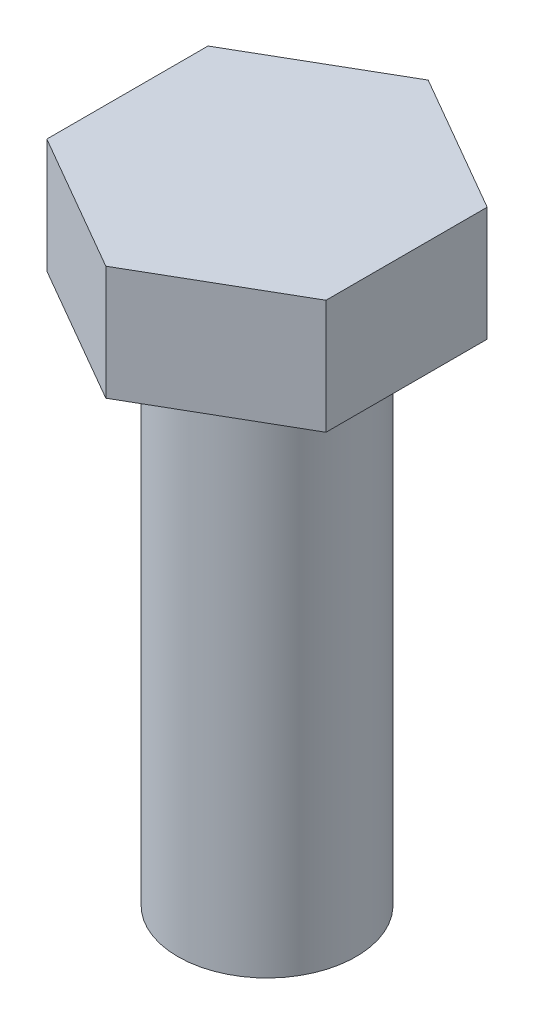
ISO-10303-21;
HEADER;
FILE_DESCRIPTION(('STEP AP214'),'2;1');
FILE_NAME('part.step','',(''),(''),'','','');
FILE_SCHEMA(('AUTOMOTIVE_DESIGN { 1 0 10303 214 1 1 1 1 }'));
ENDSEC;
DATA;
#1=APPLICATION_CONTEXT('core data for automotive mechanical design processes');
#2=APPLICATION_PROTOCOL_DEFINITION('international standard','automotive_design',2000,#1);
#3=PRODUCT_CONTEXT('',#1,'mechanical');
#4=PRODUCT('Part','Part','',(#3));
#5=PRODUCT_RELATED_PRODUCT_CATEGORY('part','',(#4));
#6=PRODUCT_DEFINITION_FORMATION('','',#4);
#7=PRODUCT_DEFINITION_CONTEXT('part definition',#1,'design');
#8=PRODUCT_DEFINITION('design','',#6,#7);
#9=PRODUCT_DEFINITION_SHAPE('','',#8);
#10=(LENGTH_UNIT() NAMED_UNIT(*) SI_UNIT(.MILLI.,.METRE.));
#11=(NAMED_UNIT(*) PLANE_ANGLE_UNIT() SI_UNIT($,.RADIAN.));
#12=(NAMED_UNIT(*) SI_UNIT($,.STERADIAN.) SOLID_ANGLE_UNIT());
#13=UNCERTAINTY_MEASURE_WITH_UNIT(LENGTH_MEASURE(1.E-05),#10,'distance_accuracy_value','');
#14=(GEOMETRIC_REPRESENTATION_CONTEXT(3) GLOBAL_UNCERTAINTY_ASSIGNED_CONTEXT((#13)) GLOBAL_UNIT_ASSIGNED_CONTEXT((#10,
#11,#12)) REPRESENTATION_CONTEXT('',''));
#15=CARTESIAN_POINT('',(0.,0.,0.));
#16=DIRECTION('',(0.,0.,1.));
#17=DIRECTION('',(1.,0.,0.));
#18=AXIS2_PLACEMENT_3D('',#15,#16,#17);
#19=CARTESIAN_POINT('',(9.39999999999995,7.7,-5.4270925303826));
#20=DIRECTION('',(-0.499999999999995,0.,0.866025403784442));
#21=DIRECTION('',(0.866025403784442,0.,0.499999999999995));
#22=AXIS2_PLACEMENT_3D('',#19,#20,#21);
#23=PLANE('',#22);
#24=DIRECTION('',(-0.866025403784441,0.,-0.499999999999995));
#25=VECTOR('',#24,1.);
#26=CARTESIAN_POINT('',(9.39999999999995,0.,-5.4270925303826));
#27=LINE('',#26,#25);
#28=CARTESIAN_POINT('',(9.39999999999995,0.,-5.4270925303826));
#29=VERTEX_POINT('',#28);
#30=CARTESIAN_POINT('',(0.,0.,-10.854185060765));
#31=VERTEX_POINT('',#30);
#32=EDGE_CURVE('E121',#29,#31,#27,.T.);
#33=ORIENTED_EDGE('',*,*,#32,.T.);
#34=DIRECTION('',(0.,-1.,0.));
#35=VECTOR('',#34,1.);
#36=CARTESIAN_POINT('',(0.,7.7,-10.854185060765));
#37=LINE('',#36,#35);
#38=CARTESIAN_POINT('',(0.,7.7,-10.854185060765));
#39=VERTEX_POINT('',#38);
#40=EDGE_CURVE('E38',#39,#31,#37,.T.);
#41=ORIENTED_EDGE('',*,*,#40,.F.);
#42=DIRECTION('',(-0.866025403784441,0.,-0.499999999999995));
#43=VECTOR('',#42,1.);
#44=CARTESIAN_POINT('',(9.39999999999995,7.7,-5.4270925303826));
#45=LINE('',#44,#43);
#46=CARTESIAN_POINT('',(9.39999999999995,7.7,-5.4270925303826));
#47=VERTEX_POINT('',#46);
#48=EDGE_CURVE('E132',#47,#39,#45,.T.);
#49=ORIENTED_EDGE('',*,*,#48,.F.);
#50=DIRECTION('',(0.,-1.,0.));
#51=VECTOR('',#50,1.);
#52=CARTESIAN_POINT('',(9.39999999999995,7.7,-5.4270925303826));
#53=LINE('',#52,#51);
#54=EDGE_CURVE('E117',#47,#29,#53,.T.);
#55=ORIENTED_EDGE('',*,*,#54,.T.);
#56=EDGE_LOOP('',(#33,#41,#49,#55));
#57=FACE_BOUND('',#56,.T.);
#58=ADVANCED_FACE('F35',(#57),#23,.F.);
#59=CARTESIAN_POINT('',(0.,7.7,-10.854185060765));
#60=DIRECTION('',(0.500000000000001,0.,0.866025403784438));
#61=DIRECTION('',(0.866025403784438,0.,-0.500000000000001));
#62=AXIS2_PLACEMENT_3D('',#59,#60,#61);
#63=PLANE('',#62);
#64=DIRECTION('',(-0.866025403784438,0.,0.500000000000001));
#65=VECTOR('',#64,1.);
#66=CARTESIAN_POINT('',(0.,0.,-10.854185060765));
#67=LINE('',#66,#65);
#68=CARTESIAN_POINT('',(-9.40000000000002,0.,-5.42709253038247));
#69=VERTEX_POINT('',#68);
#70=EDGE_CURVE('E124',#31,#69,#67,.T.);
#71=ORIENTED_EDGE('',*,*,#70,.T.);
#72=DIRECTION('',(0.,-1.,0.));
#73=VECTOR('',#72,1.);
#74=CARTESIAN_POINT('',(-9.40000000000002,7.7,-5.42709253038247));
#75=LINE('',#74,#73);
#76=CARTESIAN_POINT('',(-9.40000000000002,7.7,-5.42709253038247));
#77=VERTEX_POINT('',#76);
#78=EDGE_CURVE('E135',#77,#69,#75,.T.);
#79=ORIENTED_EDGE('',*,*,#78,.F.);
#80=DIRECTION('',(-0.866025403784438,0.,0.500000000000001));
#81=VECTOR('',#80,1.);
#82=CARTESIAN_POINT('',(0.,7.7,-10.854185060765));
#83=LINE('',#82,#81);
#84=EDGE_CURVE('E90',#39,#77,#83,.T.);
#85=ORIENTED_EDGE('',*,*,#84,.F.);
#86=ORIENTED_EDGE('',*,*,#40,.T.);
#87=EDGE_LOOP('',(#71,#79,#85,#86));
#88=FACE_BOUND('',#87,.T.);
#89=ADVANCED_FACE('F140',(#88),#63,.F.);
#90=CARTESIAN_POINT('',(-9.40000000000002,7.7,-5.42709253038247));
#91=DIRECTION('',(1.,0.,0.));
#92=DIRECTION('',(0.,0.,-1.));
#93=AXIS2_PLACEMENT_3D('',#90,#91,#92);
#94=PLANE('',#93);
#95=DIRECTION('',(0.,0.,1.));
#96=VECTOR('',#95,1.);
#97=CARTESIAN_POINT('',(-9.40000000000002,0.,-5.42709253038247));
#98=LINE('',#97,#96);
#99=CARTESIAN_POINT('',(-9.39999999999998,0.,5.42709253038253));
#100=VERTEX_POINT('',#99);
#101=EDGE_CURVE('E127',#69,#100,#98,.T.);
#102=ORIENTED_EDGE('',*,*,#101,.T.);
#103=DIRECTION('',(0.,-1.,0.));
#104=VECTOR('',#103,1.);
#105=CARTESIAN_POINT('',(-9.39999999999998,7.7,5.42709253038253));
#106=LINE('',#105,#104);
#107=CARTESIAN_POINT('',(-9.39999999999998,7.7,5.42709253038253));
#108=VERTEX_POINT('',#107);
#109=EDGE_CURVE('E112',#108,#100,#106,.T.);
#110=ORIENTED_EDGE('',*,*,#109,.F.);
#111=DIRECTION('',(0.,0.,1.));
#112=VECTOR('',#111,1.);
#113=CARTESIAN_POINT('',(-9.40000000000002,7.7,-5.42709253038247));
#114=LINE('',#113,#112);
#115=EDGE_CURVE('E103',#77,#108,#114,.T.);
#116=ORIENTED_EDGE('',*,*,#115,.F.);
#117=ORIENTED_EDGE('',*,*,#78,.T.);
#118=EDGE_LOOP('',(#102,#110,#116,#117));
#119=FACE_BOUND('',#118,.T.);
#120=ADVANCED_FACE('F146',(#119),#94,.F.);
#121=CARTESIAN_POINT('',(-9.39999999999998,7.7,5.42709253038253));
#122=DIRECTION('',(0.499999999999995,0.,-0.866025403784442));
#123=DIRECTION('',(-0.866025403784442,0.,-0.499999999999995));
#124=AXIS2_PLACEMENT_3D('',#121,#122,#123);
#125=PLANE('',#124);
#126=DIRECTION('',(0.866025403784441,0.,0.499999999999995));
#127=VECTOR('',#126,1.);
#128=CARTESIAN_POINT('',(-9.39999999999998,0.,5.42709253038253));
#129=LINE('',#128,#127);
#130=CARTESIAN_POINT('',(0.,0.,10.854185060765));
#131=VERTEX_POINT('',#130);
#132=EDGE_CURVE('E111',#100,#131,#129,.T.);
#133=ORIENTED_EDGE('',*,*,#132,.T.);
#134=DIRECTION('',(0.,-1.,0.));
#135=VECTOR('',#134,1.);
#136=CARTESIAN_POINT('',(0.,7.7,10.854185060765));
#137=LINE('',#136,#135);
#138=CARTESIAN_POINT('',(0.,7.7,10.854185060765));
#139=VERTEX_POINT('',#138);
#140=EDGE_CURVE('E108',#139,#131,#137,.T.);
#141=ORIENTED_EDGE('',*,*,#140,.F.);
#142=DIRECTION('',(0.866025403784441,0.,0.499999999999995));
#143=VECTOR('',#142,1.);
#144=CARTESIAN_POINT('',(-9.39999999999998,7.7,5.42709253038253));
#145=LINE('',#144,#143);
#146=EDGE_CURVE('E97',#108,#139,#145,.T.);
#147=ORIENTED_EDGE('',*,*,#146,.F.);
#148=ORIENTED_EDGE('',*,*,#109,.T.);
#149=EDGE_LOOP('',(#133,#141,#147,#148));
#150=FACE_BOUND('',#149,.T.);
#151=ADVANCED_FACE('F109',(#150),#125,.F.);
#152=CARTESIAN_POINT('',(0.,7.7,10.854185060765));
#153=DIRECTION('',(-0.500000000000007,0.,-0.866025403784435));
#154=DIRECTION('',(-0.866025403784435,0.,0.500000000000007));
#155=AXIS2_PLACEMENT_3D('',#152,#153,#154);
#156=PLANE('',#155);
#157=DIRECTION('',(0.866025403784435,0.,-0.500000000000007));
#158=VECTOR('',#157,1.);
#159=CARTESIAN_POINT('',(0.,0.,10.854185060765));
#160=LINE('',#159,#158);
#161=CARTESIAN_POINT('',(9.40000000000006,0.,5.4270925303824));
#162=VERTEX_POINT('',#161);
#163=EDGE_CURVE('E75',#131,#162,#160,.T.);
#164=ORIENTED_EDGE('',*,*,#163,.T.);
#165=DIRECTION('',(0.,-1.,0.));
#166=VECTOR('',#165,1.);
#167=CARTESIAN_POINT('',(9.40000000000006,7.7,5.4270925303824));
#168=LINE('',#167,#166);
#169=CARTESIAN_POINT('',(9.40000000000006,7.7,5.4270925303824));
#170=VERTEX_POINT('',#169);
#171=EDGE_CURVE('E113',#170,#162,#168,.T.);
#172=ORIENTED_EDGE('',*,*,#171,.F.);
#173=DIRECTION('',(0.866025403784435,0.,-0.500000000000007));
#174=VECTOR('',#173,1.);
#175=CARTESIAN_POINT('',(0.,7.7,10.854185060765));
#176=LINE('',#175,#174);
#177=EDGE_CURVE('E101',#139,#170,#176,.T.);
#178=ORIENTED_EDGE('',*,*,#177,.F.);
#179=ORIENTED_EDGE('',*,*,#140,.T.);
#180=EDGE_LOOP('',(#164,#172,#178,#179));
#181=FACE_BOUND('',#180,.T.);
#182=ADVANCED_FACE('F115',(#181),#156,.F.);
#183=CARTESIAN_POINT('',(9.40000000000006,7.7,5.4270925303824));
#184=DIRECTION('',(-1.,0.,0.));
#185=DIRECTION('',(0.,0.,1.));
#186=AXIS2_PLACEMENT_3D('',#183,#184,#185);
#187=PLANE('',#186);
#188=DIRECTION('',(0.,0.,-1.));
#189=VECTOR('',#188,1.);
#190=CARTESIAN_POINT('',(9.40000000000006,0.,5.4270925303824));
#191=LINE('',#190,#189);
#192=EDGE_CURVE('E81',#162,#29,#191,.T.);
#193=ORIENTED_EDGE('',*,*,#192,.T.);
#194=ORIENTED_EDGE('',*,*,#54,.F.);
#195=DIRECTION('',(0.,0.,-1.));
#196=VECTOR('',#195,1.);
#197=CARTESIAN_POINT('',(9.40000000000006,7.7,5.4270925303824));
#198=LINE('',#197,#196);
#199=EDGE_CURVE('E52',#170,#47,#198,.T.);
#200=ORIENTED_EDGE('',*,*,#199,.F.);
#201=ORIENTED_EDGE('',*,*,#171,.T.);
#202=EDGE_LOOP('',(#193,#194,#200,#201));
#203=FACE_BOUND('',#202,.T.);
#204=ADVANCED_FACE('F166',(#203),#187,.F.);
#205=CARTESIAN_POINT('',(0.,7.7,0.));
#206=DIRECTION('',(0.,1.,0.));
#207=DIRECTION('',(0.,0.,1.));
#208=AXIS2_PLACEMENT_3D('',#205,#206,#207);
#209=PLANE('',#208);
#210=ORIENTED_EDGE('',*,*,#48,.T.);
#211=ORIENTED_EDGE('',*,*,#84,.T.);
#212=ORIENTED_EDGE('',*,*,#115,.T.);
#213=ORIENTED_EDGE('',*,*,#146,.T.);
#214=ORIENTED_EDGE('',*,*,#177,.T.);
#215=ORIENTED_EDGE('',*,*,#199,.T.);
#216=EDGE_LOOP('',(#210,#211,#212,#213,#214,#215));
#217=FACE_BOUND('',#216,.T.);
#218=ADVANCED_FACE('F99',(#217),#209,.T.);
#219=CARTESIAN_POINT('',(0.,0.,0.));
#220=DIRECTION('',(0.,1.,0.));
#221=DIRECTION('',(0.,0.,1.));
#222=AXIS2_PLACEMENT_3D('',#219,#220,#221);
#223=PLANE('',#222);
#224=CARTESIAN_POINT('',(0.,0.,0.));
#225=DIRECTION('',(0.,-1.,0.));
#226=DIRECTION('',(0.,0.,-1.));
#227=AXIS2_PLACEMENT_3D('',#224,#225,#226);
#228=CIRCLE('',#227,6.);
#229=CARTESIAN_POINT('',(0.,0.,-6.));
#230=VERTEX_POINT('',#229);
#231=EDGE_CURVE('E11',#230,#230,#228,.T.);
#232=ORIENTED_EDGE('',*,*,#231,.F.);
#233=EDGE_LOOP('',(#232));
#234=FACE_BOUND('',#233,.T.);
#235=ORIENTED_EDGE('',*,*,#32,.F.);
#236=ORIENTED_EDGE('',*,*,#192,.F.);
#237=ORIENTED_EDGE('',*,*,#163,.F.);
#238=ORIENTED_EDGE('',*,*,#132,.F.);
#239=ORIENTED_EDGE('',*,*,#101,.F.);
#240=ORIENTED_EDGE('',*,*,#70,.F.);
#241=EDGE_LOOP('',(#235,#236,#237,#238,#239,#240));
#242=FACE_BOUND('',#241,.T.);
#243=ADVANCED_FACE('F145',(#234,#242),#223,.F.);
#244=CARTESIAN_POINT('',(0.,-35.,0.));
#245=DIRECTION('',(0.,1.,0.));
#246=DIRECTION('',(0.,0.,1.));
#247=AXIS2_PLACEMENT_3D('',#244,#245,#246);
#248=CYLINDRICAL_SURFACE('',#247,6.);
#249=CARTESIAN_POINT('',(0.,-35.,0.));
#250=DIRECTION('',(0.,-1.,0.));
#251=DIRECTION('',(0.,0.,-1.));
#252=AXIS2_PLACEMENT_3D('',#249,#250,#251);
#253=CIRCLE('',#252,6.);
#254=CARTESIAN_POINT('',(0.,-35.,-6.));
#255=VERTEX_POINT('',#254);
#256=EDGE_CURVE('E125',#255,#255,#253,.T.);
#257=ORIENTED_EDGE('',*,*,#256,.F.);
#258=EDGE_LOOP('',(#257));
#259=FACE_BOUND('',#258,.T.);
#260=ORIENTED_EDGE('',*,*,#231,.T.);
#261=EDGE_LOOP('',(#260));
#262=FACE_BOUND('',#261,.T.);
#263=ADVANCED_FACE('F155',(#259,#262),#248,.T.);
#264=CARTESIAN_POINT('',(0.,-35.,0.));
#265=DIRECTION('',(0.,-1.,0.));
#266=DIRECTION('',(0.,0.,-1.));
#267=AXIS2_PLACEMENT_3D('',#264,#265,#266);
#268=PLANE('',#267);
#269=ORIENTED_EDGE('',*,*,#256,.T.);
#270=EDGE_LOOP('',(#269));
#271=FACE_BOUND('',#270,.T.);
#272=ADVANCED_FACE('F153',(#271),#268,.T.);
#273=CLOSED_SHELL('',(#58,#89,#120,#151,#182,#204,#218,#243,#263,#272));
#274=MANIFOLD_SOLID_BREP('B2',#273);
#275=ADVANCED_BREP_SHAPE_REPRESENTATION('',(#18,#274),#14);
#276=SHAPE_DEFINITION_REPRESENTATION(#9,#275);
ENDSEC;
END-ISO-10303-21;
